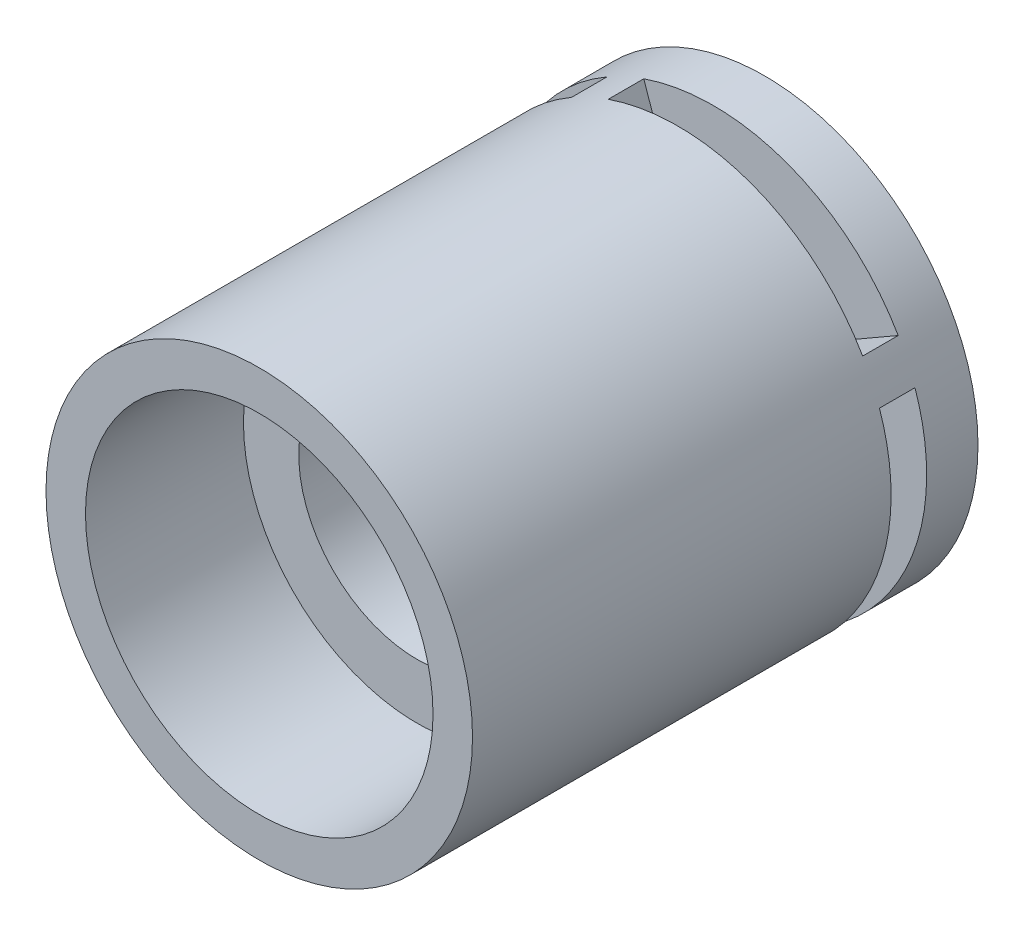
ISO-10303-21;
HEADER;
FILE_DESCRIPTION(('STEP AP214'),'2;1');
FILE_NAME('part.step','',(''),(''),'','','');
FILE_SCHEMA(('AUTOMOTIVE_DESIGN { 1 0 10303 214 1 1 1 1 }'));
ENDSEC;
DATA;
#1=APPLICATION_CONTEXT('core data for automotive mechanical design processes');
#2=APPLICATION_PROTOCOL_DEFINITION('international standard','automotive_design',2000,#1);
#3=PRODUCT_CONTEXT('',#1,'mechanical');
#4=PRODUCT('Part','Part','',(#3));
#5=PRODUCT_RELATED_PRODUCT_CATEGORY('part','',(#4));
#6=PRODUCT_DEFINITION_FORMATION('','',#4);
#7=PRODUCT_DEFINITION_CONTEXT('part definition',#1,'design');
#8=PRODUCT_DEFINITION('design','',#6,#7);
#9=PRODUCT_DEFINITION_SHAPE('','',#8);
#10=(LENGTH_UNIT() NAMED_UNIT(*) SI_UNIT(.MILLI.,.METRE.));
#11=(NAMED_UNIT(*) PLANE_ANGLE_UNIT() SI_UNIT($,.RADIAN.));
#12=(NAMED_UNIT(*) SI_UNIT($,.STERADIAN.) SOLID_ANGLE_UNIT());
#13=UNCERTAINTY_MEASURE_WITH_UNIT(LENGTH_MEASURE(1.E-05),#10,'distance_accuracy_value','');
#14=(GEOMETRIC_REPRESENTATION_CONTEXT(3) GLOBAL_UNCERTAINTY_ASSIGNED_CONTEXT((#13)) GLOBAL_UNIT_ASSIGNED_CONTEXT((#10,
#11,#12)) REPRESENTATION_CONTEXT('',''));
#15=CARTESIAN_POINT('',(0.,0.,0.));
#16=DIRECTION('',(0.,0.,1.));
#17=DIRECTION('',(1.,0.,0.));
#18=AXIS2_PLACEMENT_3D('',#15,#16,#17);
#19=CARTESIAN_POINT('',(0.,0.,-32.));
#20=DIRECTION('',(0.,0.,1.));
#21=DIRECTION('',(1.,0.,0.));
#22=AXIS2_PLACEMENT_3D('',#19,#20,#21);
#23=CYLINDRICAL_SURFACE('',#22,13.5);
#24=DIRECTION('',(0.,0.,-1.));
#25=VECTOR('',#24,1.);
#26=CARTESIAN_POINT('',(6.7374281199444,-11.6985923225225,-26.5));
#27=LINE('',#26,#25);
#28=CARTESIAN_POINT('',(6.7374281199444,-11.6985923225225,-26.5));
#29=VERTEX_POINT('',#28);
#30=CARTESIAN_POINT('',(6.7374281199444,-11.6985923225225,-28.75));
#31=VERTEX_POINT('',#30);
#32=EDGE_CURVE('E306',#29,#31,#27,.T.);
#33=ORIENTED_EDGE('',*,*,#32,.F.);
#34=CARTESIAN_POINT('',(0.,0.,-26.5));
#35=DIRECTION('',(0.,0.,1.));
#36=DIRECTION('',(0.945167105626872,0.326587113096831,0.));
#37=AXIS2_PLACEMENT_3D('',#34,#35,#36);
#38=CIRCLE('',#37,13.5);
#39=CARTESIAN_POINT('',(12.7597559259628,4.40892602680721,-26.5));
#40=VERTEX_POINT('',#39);
#41=EDGE_CURVE('E311',#29,#40,#38,.T.);
#42=ORIENTED_EDGE('',*,*,#41,.T.);
#43=DIRECTION('',(0.,0.,1.));
#44=VECTOR('',#43,1.);
#45=CARTESIAN_POINT('',(12.7597559259628,4.40892602680721,-28.75));
#46=LINE('',#45,#44);
#47=CARTESIAN_POINT('',(12.7597559259628,4.40892602680721,-28.75));
#48=VERTEX_POINT('',#47);
#49=EDGE_CURVE('E195',#48,#40,#46,.T.);
#50=ORIENTED_EDGE('',*,*,#49,.F.);
#51=CARTESIAN_POINT('',(0.,0.,-28.75));
#52=DIRECTION('',(0.,0.,1.));
#53=DIRECTION('',(0.945167105626872,0.326587113096831,0.));
#54=AXIS2_PLACEMENT_3D('',#51,#52,#53);
#55=CIRCLE('',#54,13.5);
#56=EDGE_CURVE('E299',#31,#48,#55,.T.);
#57=ORIENTED_EDGE('',*,*,#56,.F.);
#58=EDGE_LOOP('',(#33,#42,#50,#57));
#59=FACE_BOUND('',#58,.T.);
#60=DIRECTION('',(0.,0.,-1.));
#61=VECTOR('',#60,1.);
#62=CARTESIAN_POINT('',(-11.6985923225225,-6.73742811994444,-26.5));
#63=LINE('',#62,#61);
#64=CARTESIAN_POINT('',(-11.6985923225225,-6.73742811994444,-26.5));
#65=VERTEX_POINT('',#64);
#66=CARTESIAN_POINT('',(-11.6985923225225,-6.73742811994444,-28.75));
#67=VERTEX_POINT('',#66);
#68=EDGE_CURVE('E334',#65,#67,#63,.T.);
#69=ORIENTED_EDGE('',*,*,#68,.F.);
#70=CARTESIAN_POINT('',(0.,0.,-26.5));
#71=DIRECTION('',(0.,0.,1.));
#72=DIRECTION('',(0.326587113096834,-0.945167105626871,0.));
#73=AXIS2_PLACEMENT_3D('',#70,#71,#72);
#74=CIRCLE('',#73,13.5);
#75=CARTESIAN_POINT('',(4.40892602680726,-12.7597559259628,-26.5));
#76=VERTEX_POINT('',#75);
#77=EDGE_CURVE('E338',#65,#76,#74,.T.);
#78=ORIENTED_EDGE('',*,*,#77,.T.);
#79=DIRECTION('',(0.,0.,1.));
#80=VECTOR('',#79,1.);
#81=CARTESIAN_POINT('',(4.40892602680726,-12.7597559259628,-28.75));
#82=LINE('',#81,#80);
#83=CARTESIAN_POINT('',(4.40892602680726,-12.7597559259628,-28.75));
#84=VERTEX_POINT('',#83);
#85=EDGE_CURVE('E327',#84,#76,#82,.T.);
#86=ORIENTED_EDGE('',*,*,#85,.F.);
#87=CARTESIAN_POINT('',(0.,0.,-28.75));
#88=DIRECTION('',(0.,0.,1.));
#89=DIRECTION('',(0.326587113096834,-0.945167105626871,0.));
#90=AXIS2_PLACEMENT_3D('',#87,#88,#89);
#91=CIRCLE('',#90,13.5);
#92=EDGE_CURVE('E329',#67,#84,#91,.T.);
#93=ORIENTED_EDGE('',*,*,#92,.F.);
#94=EDGE_LOOP('',(#69,#78,#86,#93));
#95=FACE_BOUND('',#94,.T.);
#96=DIRECTION('',(0.,0.,-1.));
#97=VECTOR('',#96,1.);
#98=CARTESIAN_POINT('',(-6.73742811994432,11.6985923225226,-26.5));
#99=LINE('',#98,#97);
#100=CARTESIAN_POINT('',(-6.73742811994432,11.6985923225226,-26.5));
#101=VERTEX_POINT('',#100);
#102=CARTESIAN_POINT('',(-6.73742811994431,11.6985923225226,-28.75));
#103=VERTEX_POINT('',#102);
#104=EDGE_CURVE('E362',#101,#103,#99,.T.);
#105=ORIENTED_EDGE('',*,*,#104,.F.);
#106=CARTESIAN_POINT('',(0.,0.,-26.5));
#107=DIRECTION('',(0.,0.,1.));
#108=DIRECTION('',(-0.945167105626874,-0.326587113096824,0.));
#109=AXIS2_PLACEMENT_3D('',#106,#107,#108);
#110=CIRCLE('',#109,13.5);
#111=CARTESIAN_POINT('',(-12.7597559259628,-4.40892602680712,-26.5));
#112=VERTEX_POINT('',#111);
#113=EDGE_CURVE('E366',#101,#112,#110,.T.);
#114=ORIENTED_EDGE('',*,*,#113,.T.);
#115=DIRECTION('',(0.,0.,1.));
#116=VECTOR('',#115,1.);
#117=CARTESIAN_POINT('',(-12.7597559259628,-4.40892602680712,-28.75));
#118=LINE('',#117,#116);
#119=CARTESIAN_POINT('',(-12.7597559259628,-4.40892602680712,-28.75));
#120=VERTEX_POINT('',#119);
#121=EDGE_CURVE('E353',#120,#112,#118,.T.);
#122=ORIENTED_EDGE('',*,*,#121,.F.);
#123=CARTESIAN_POINT('',(0.,0.,-28.75));
#124=DIRECTION('',(0.,0.,1.));
#125=DIRECTION('',(-0.945167105626874,-0.326587113096824,0.));
#126=AXIS2_PLACEMENT_3D('',#123,#124,#125);
#127=CIRCLE('',#126,13.5);
#128=EDGE_CURVE('E357',#103,#120,#127,.T.);
#129=ORIENTED_EDGE('',*,*,#128,.F.);
#130=EDGE_LOOP('',(#105,#114,#122,#129));
#131=FACE_BOUND('',#130,.T.);
#132=DIRECTION('',(0.,0.,-1.));
#133=VECTOR('',#132,1.);
#134=CARTESIAN_POINT('',(11.6985923225226,6.73742811994427,-26.5));
#135=LINE('',#134,#133);
#136=CARTESIAN_POINT('',(11.6985923225226,6.73742811994427,-26.5));
#137=VERTEX_POINT('',#136);
#138=CARTESIAN_POINT('',(11.6985923225226,6.73742811994427,-28.75));
#139=VERTEX_POINT('',#138);
#140=EDGE_CURVE('E390',#137,#139,#135,.T.);
#141=ORIENTED_EDGE('',*,*,#140,.F.);
#142=CARTESIAN_POINT('',(0.,0.,-26.5));
#143=DIRECTION('',(0.,0.,1.));
#144=DIRECTION('',(-0.326587113096821,0.945167105626875,0.));
#145=AXIS2_PLACEMENT_3D('',#142,#143,#144);
#146=CIRCLE('',#145,13.5);
#147=CARTESIAN_POINT('',(-4.40892602680708,12.7597559259628,-26.5));
#148=VERTEX_POINT('',#147);
#149=EDGE_CURVE('E394',#137,#148,#146,.T.);
#150=ORIENTED_EDGE('',*,*,#149,.T.);
#151=DIRECTION('',(0.,0.,1.));
#152=VECTOR('',#151,1.);
#153=CARTESIAN_POINT('',(-4.40892602680708,12.7597559259628,-28.75));
#154=LINE('',#153,#152);
#155=CARTESIAN_POINT('',(-4.40892602680708,12.7597559259628,-28.75));
#156=VERTEX_POINT('',#155);
#157=EDGE_CURVE('E381',#156,#148,#154,.T.);
#158=ORIENTED_EDGE('',*,*,#157,.F.);
#159=CARTESIAN_POINT('',(0.,0.,-28.75));
#160=DIRECTION('',(0.,0.,1.));
#161=DIRECTION('',(-0.326587113096821,0.945167105626875,0.));
#162=AXIS2_PLACEMENT_3D('',#159,#160,#161);
#163=CIRCLE('',#162,13.5);
#164=EDGE_CURVE('E385',#139,#156,#163,.T.);
#165=ORIENTED_EDGE('',*,*,#164,.F.);
#166=EDGE_LOOP('',(#141,#150,#158,#165));
#167=FACE_BOUND('',#166,.T.);
#168=CARTESIAN_POINT('',(0.,0.,-32.));
#169=DIRECTION('',(0.,0.,1.));
#170=DIRECTION('',(1.,0.,0.));
#171=AXIS2_PLACEMENT_3D('',#168,#169,#170);
#172=CIRCLE('',#171,13.5);
#173=CARTESIAN_POINT('',(13.5,0.,-32.));
#174=VERTEX_POINT('',#173);
#175=EDGE_CURVE('E426',#174,#174,#172,.T.);
#176=ORIENTED_EDGE('',*,*,#175,.T.);
#177=EDGE_LOOP('',(#176));
#178=FACE_BOUND('',#177,.T.);
#179=CARTESIAN_POINT('',(0.,0.,0.));
#180=DIRECTION('',(0.,0.,1.));
#181=DIRECTION('',(1.,0.,0.));
#182=AXIS2_PLACEMENT_3D('',#179,#180,#181);
#183=CIRCLE('',#182,13.5);
#184=CARTESIAN_POINT('',(13.5,0.,0.));
#185=VERTEX_POINT('',#184);
#186=EDGE_CURVE('E421',#185,#185,#183,.T.);
#187=ORIENTED_EDGE('',*,*,#186,.F.);
#188=EDGE_LOOP('',(#187));
#189=FACE_BOUND('',#188,.T.);
#190=ADVANCED_FACE('F180',(#59,#95,#131,#167,#178,#189),#23,.T.);
#191=CARTESIAN_POINT('',(0.,0.,-32.));
#192=DIRECTION('',(0.,0.,1.));
#193=DIRECTION('',(1.,0.,0.));
#194=AXIS2_PLACEMENT_3D('',#191,#192,#193);
#195=PLANE('',#194);
#196=ORIENTED_EDGE('',*,*,#175,.F.);
#197=EDGE_LOOP('',(#196));
#198=FACE_BOUND('',#197,.T.);
#199=ADVANCED_FACE('F506',(#198),#195,.F.);
#200=CARTESIAN_POINT('',(0.,0.,0.));
#201=DIRECTION('',(0.,0.,1.));
#202=DIRECTION('',(1.,0.,0.));
#203=AXIS2_PLACEMENT_3D('',#200,#201,#202);
#204=PLANE('',#203);
#205=CARTESIAN_POINT('',(0.,0.,0.));
#206=DIRECTION('',(0.,0.,1.));
#207=DIRECTION('',(1.,0.,0.));
#208=AXIS2_PLACEMENT_3D('',#205,#206,#207);
#209=CIRCLE('',#208,11.);
#210=CARTESIAN_POINT('',(11.,0.,0.));
#211=VERTEX_POINT('',#210);
#212=EDGE_CURVE('E422',#211,#211,#209,.T.);
#213=ORIENTED_EDGE('',*,*,#212,.F.);
#214=EDGE_LOOP('',(#213));
#215=FACE_BOUND('',#214,.T.);
#216=ORIENTED_EDGE('',*,*,#186,.T.);
#217=EDGE_LOOP('',(#216));
#218=FACE_BOUND('',#217,.T.);
#219=ADVANCED_FACE('F512',(#215,#218),#204,.T.);
#220=CARTESIAN_POINT('',(0.,0.,-10.));
#221=DIRECTION('',(0.,0.,1.));
#222=DIRECTION('',(1.,0.,0.));
#223=AXIS2_PLACEMENT_3D('',#220,#221,#222);
#224=CYLINDRICAL_SURFACE('',#223,11.);
#225=CARTESIAN_POINT('',(0.,0.,-10.));
#226=DIRECTION('',(0.,0.,1.));
#227=DIRECTION('',(1.,0.,0.));
#228=AXIS2_PLACEMENT_3D('',#225,#226,#227);
#229=CIRCLE('',#228,11.);
#230=CARTESIAN_POINT('',(11.,0.,-10.));
#231=VERTEX_POINT('',#230);
#232=EDGE_CURVE('E417',#231,#231,#229,.T.);
#233=ORIENTED_EDGE('',*,*,#232,.F.);
#234=EDGE_LOOP('',(#233));
#235=FACE_BOUND('',#234,.T.);
#236=ORIENTED_EDGE('',*,*,#212,.T.);
#237=EDGE_LOOP('',(#236));
#238=FACE_BOUND('',#237,.T.);
#239=ADVANCED_FACE('F518',(#235,#238),#224,.F.);
#240=CARTESIAN_POINT('',(0.,0.,-10.));
#241=DIRECTION('',(0.,0.,1.));
#242=DIRECTION('',(1.,0.,0.));
#243=AXIS2_PLACEMENT_3D('',#240,#241,#242);
#244=PLANE('',#243);
#245=CARTESIAN_POINT('',(0.,0.,-10.));
#246=DIRECTION('',(0.,0.,1.));
#247=DIRECTION('',(1.,0.,0.));
#248=AXIS2_PLACEMENT_3D('',#245,#246,#247);
#249=CIRCLE('',#248,7.5);
#250=CARTESIAN_POINT('',(7.5,0.,-10.));
#251=VERTEX_POINT('',#250);
#252=EDGE_CURVE('E416',#251,#251,#249,.T.);
#253=ORIENTED_EDGE('',*,*,#252,.F.);
#254=EDGE_LOOP('',(#253));
#255=FACE_BOUND('',#254,.T.);
#256=ORIENTED_EDGE('',*,*,#232,.T.);
#257=EDGE_LOOP('',(#256));
#258=FACE_BOUND('',#257,.T.);
#259=ADVANCED_FACE('F524',(#255,#258),#244,.T.);
#260=CARTESIAN_POINT('',(0.,0.,-30.));
#261=DIRECTION('',(0.,0.,1.));
#262=DIRECTION('',(1.,0.,0.));
#263=AXIS2_PLACEMENT_3D('',#260,#261,#262);
#264=CYLINDRICAL_SURFACE('',#263,7.5);
#265=CARTESIAN_POINT('',(0.,0.,-26.5));
#266=DIRECTION('',(0.,0.,-1.));
#267=DIRECTION('',(-1.,0.,0.));
#268=AXIS2_PLACEMENT_3D('',#265,#266,#267);
#269=CIRCLE('',#268,7.5);
#270=CARTESIAN_POINT('',(7.08875329220154,2.44940334822623,-26.5));
#271=VERTEX_POINT('',#270);
#272=CARTESIAN_POINT('',(3.74301562219133,-6.49921795695695,-26.5));
#273=VERTEX_POINT('',#272);
#274=EDGE_CURVE('E484',#271,#273,#269,.T.);
#275=ORIENTED_EDGE('',*,*,#274,.T.);
#276=DIRECTION('',(0.,0.,1.));
#277=VECTOR('',#276,1.);
#278=CARTESIAN_POINT('',(3.74301562219133,-6.49921795695695,-30.));
#279=LINE('',#278,#277);
#280=CARTESIAN_POINT('',(3.74301562219133,-6.49921795695695,-28.75));
#281=VERTEX_POINT('',#280);
#282=EDGE_CURVE('E13',#273,#281,#279,.F.);
#283=ORIENTED_EDGE('',*,*,#282,.T.);
#284=CARTESIAN_POINT('',(0.,0.,-28.75));
#285=DIRECTION('',(0.,0.,-1.));
#286=DIRECTION('',(-1.,0.,0.));
#287=AXIS2_PLACEMENT_3D('',#284,#285,#286);
#288=CIRCLE('',#287,7.5);
#289=CARTESIAN_POINT('',(7.08875329220154,2.44940334822623,-28.75));
#290=VERTEX_POINT('',#289);
#291=EDGE_CURVE('E188',#281,#290,#288,.F.);
#292=ORIENTED_EDGE('',*,*,#291,.T.);
#293=DIRECTION('',(0.,0.,1.));
#294=VECTOR('',#293,1.);
#295=CARTESIAN_POINT('',(7.08875329220154,2.44940334822623,-30.));
#296=LINE('',#295,#294);
#297=EDGE_CURVE('E488',#290,#271,#296,.T.);
#298=ORIENTED_EDGE('',*,*,#297,.T.);
#299=EDGE_LOOP('',(#275,#283,#292,#298));
#300=FACE_BOUND('',#299,.T.);
#301=CARTESIAN_POINT('',(0.,0.,-26.5));
#302=DIRECTION('',(0.,0.,-1.));
#303=DIRECTION('',(-1.,0.,0.));
#304=AXIS2_PLACEMENT_3D('',#301,#302,#303);
#305=CIRCLE('',#304,7.5);
#306=CARTESIAN_POINT('',(2.44940334822626,-7.08875329220153,-26.5));
#307=VERTEX_POINT('',#306);
#308=CARTESIAN_POINT('',(-6.49921795695693,-3.74301562219136,-26.5));
#309=VERTEX_POINT('',#308);
#310=EDGE_CURVE('E468',#307,#309,#305,.T.);
#311=ORIENTED_EDGE('',*,*,#310,.T.);
#312=DIRECTION('',(0.,0.,1.));
#313=VECTOR('',#312,1.);
#314=CARTESIAN_POINT('',(-6.49921795695693,-3.74301562219136,-30.));
#315=LINE('',#314,#313);
#316=CARTESIAN_POINT('',(-6.49921795695693,-3.74301562219136,-28.75));
#317=VERTEX_POINT('',#316);
#318=EDGE_CURVE('E480',#309,#317,#315,.F.);
#319=ORIENTED_EDGE('',*,*,#318,.T.);
#320=CARTESIAN_POINT('',(0.,0.,-28.75));
#321=DIRECTION('',(0.,0.,-1.));
#322=DIRECTION('',(-1.,0.,0.));
#323=AXIS2_PLACEMENT_3D('',#320,#321,#322);
#324=CIRCLE('',#323,7.5);
#325=CARTESIAN_POINT('',(2.44940334822626,-7.08875329220153,-28.75));
#326=VERTEX_POINT('',#325);
#327=EDGE_CURVE('E476',#317,#326,#324,.F.);
#328=ORIENTED_EDGE('',*,*,#327,.T.);
#329=DIRECTION('',(0.,0.,1.));
#330=VECTOR('',#329,1.);
#331=CARTESIAN_POINT('',(2.44940334822626,-7.08875329220153,-30.));
#332=LINE('',#331,#330);
#333=EDGE_CURVE('E472',#326,#307,#332,.T.);
#334=ORIENTED_EDGE('',*,*,#333,.T.);
#335=EDGE_LOOP('',(#311,#319,#328,#334));
#336=FACE_BOUND('',#335,.T.);
#337=CARTESIAN_POINT('',(0.,0.,-26.5));
#338=DIRECTION('',(0.,0.,-1.));
#339=DIRECTION('',(-1.,0.,0.));
#340=AXIS2_PLACEMENT_3D('',#337,#338,#339);
#341=CIRCLE('',#340,7.5);
#342=CARTESIAN_POINT('',(-7.08875329220155,-2.44940334822618,-26.5));
#343=VERTEX_POINT('',#342);
#344=CARTESIAN_POINT('',(-3.74301562219129,6.49921795695697,-26.5));
#345=VERTEX_POINT('',#344);
#346=EDGE_CURVE('E452',#343,#345,#341,.T.);
#347=ORIENTED_EDGE('',*,*,#346,.T.);
#348=DIRECTION('',(0.,0.,1.));
#349=VECTOR('',#348,1.);
#350=CARTESIAN_POINT('',(-3.74301562219129,6.49921795695697,-30.));
#351=LINE('',#350,#349);
#352=CARTESIAN_POINT('',(-3.74301562219128,6.49921795695697,-28.75));
#353=VERTEX_POINT('',#352);
#354=EDGE_CURVE('E464',#345,#353,#351,.F.);
#355=ORIENTED_EDGE('',*,*,#354,.T.);
#356=CARTESIAN_POINT('',(0.,0.,-28.75));
#357=DIRECTION('',(0.,0.,-1.));
#358=DIRECTION('',(-1.,0.,0.));
#359=AXIS2_PLACEMENT_3D('',#356,#357,#358);
#360=CIRCLE('',#359,7.5);
#361=CARTESIAN_POINT('',(-7.08875329220155,-2.44940334822618,-28.75));
#362=VERTEX_POINT('',#361);
#363=EDGE_CURVE('E460',#353,#362,#360,.F.);
#364=ORIENTED_EDGE('',*,*,#363,.T.);
#365=DIRECTION('',(0.,0.,1.));
#366=VECTOR('',#365,1.);
#367=CARTESIAN_POINT('',(-7.08875329220155,-2.44940334822618,-30.));
#368=LINE('',#367,#366);
#369=EDGE_CURVE('E456',#362,#343,#368,.T.);
#370=ORIENTED_EDGE('',*,*,#369,.T.);
#371=EDGE_LOOP('',(#347,#355,#364,#370));
#372=FACE_BOUND('',#371,.T.);
#373=CARTESIAN_POINT('',(0.,0.,-26.5));
#374=DIRECTION('',(0.,0.,-1.));
#375=DIRECTION('',(-1.,0.,0.));
#376=AXIS2_PLACEMENT_3D('',#373,#374,#375);
#377=CIRCLE('',#376,7.5);
#378=CARTESIAN_POINT('',(-2.44940334822615,7.08875329220156,-26.5));
#379=VERTEX_POINT('',#378);
#380=CARTESIAN_POINT('',(6.49921795695699,3.74301562219126,-26.5));
#381=VERTEX_POINT('',#380);
#382=EDGE_CURVE('E430',#379,#381,#377,.T.);
#383=ORIENTED_EDGE('',*,*,#382,.T.);
#384=DIRECTION('',(0.,0.,1.));
#385=VECTOR('',#384,1.);
#386=CARTESIAN_POINT('',(6.49921795695699,3.74301562219126,-30.));
#387=LINE('',#386,#385);
#388=CARTESIAN_POINT('',(6.49921795695699,3.74301562219126,-28.75));
#389=VERTEX_POINT('',#388);
#390=EDGE_CURVE('E448',#381,#389,#387,.F.);
#391=ORIENTED_EDGE('',*,*,#390,.T.);
#392=CARTESIAN_POINT('',(0.,0.,-28.75));
#393=DIRECTION('',(0.,0.,-1.));
#394=DIRECTION('',(-1.,0.,0.));
#395=AXIS2_PLACEMENT_3D('',#392,#393,#394);
#396=CIRCLE('',#395,7.5);
#397=CARTESIAN_POINT('',(-2.44940334822615,7.08875329220156,-28.75));
#398=VERTEX_POINT('',#397);
#399=EDGE_CURVE('E444',#389,#398,#396,.F.);
#400=ORIENTED_EDGE('',*,*,#399,.T.);
#401=DIRECTION('',(0.,0.,1.));
#402=VECTOR('',#401,1.);
#403=CARTESIAN_POINT('',(-2.44940334822615,7.08875329220156,-30.));
#404=LINE('',#403,#402);
#405=EDGE_CURVE('E440',#398,#379,#404,.T.);
#406=ORIENTED_EDGE('',*,*,#405,.T.);
#407=EDGE_LOOP('',(#383,#391,#400,#406));
#408=FACE_BOUND('',#407,.T.);
#409=ORIENTED_EDGE('',*,*,#252,.T.);
#410=EDGE_LOOP('',(#409));
#411=FACE_BOUND('',#410,.T.);
#412=CARTESIAN_POINT('',(0.,0.,-30.));
#413=DIRECTION('',(0.,0.,1.));
#414=DIRECTION('',(1.,0.,0.));
#415=AXIS2_PLACEMENT_3D('',#412,#413,#414);
#416=CIRCLE('',#415,7.5);
#417=CARTESIAN_POINT('',(7.5,0.,-30.));
#418=VERTEX_POINT('',#417);
#419=EDGE_CURVE('E409',#418,#418,#416,.T.);
#420=ORIENTED_EDGE('',*,*,#419,.F.);
#421=EDGE_LOOP('',(#420));
#422=FACE_BOUND('',#421,.T.);
#423=ADVANCED_FACE('F493',(#300,#336,#372,#408,#411,#422),#264,.F.);
#424=CARTESIAN_POINT('',(0.,0.,-30.));
#425=DIRECTION('',(0.,0.,1.));
#426=DIRECTION('',(1.,0.,0.));
#427=AXIS2_PLACEMENT_3D('',#424,#425,#426);
#428=PLANE('',#427);
#429=ORIENTED_EDGE('',*,*,#419,.T.);
#430=EDGE_LOOP('',(#429));
#431=FACE_BOUND('',#430,.T.);
#432=ADVANCED_FACE('F530',(#431),#428,.T.);
#433=CARTESIAN_POINT('',(11.6985923225226,6.73742811994427,-27.625));
#434=DIRECTION('',(0.499068749625502,-0.866562394260932,0.));
#435=DIRECTION('',(0.,0.,-1.));
#436=AXIS2_PLACEMENT_3D('',#433,#434,#435);
#437=PLANE('',#436);
#438=DIRECTION('',(0.866562394260932,0.499068749625502,0.));
#439=VECTOR('',#438,1.);
#440=CARTESIAN_POINT('',(11.6985923225226,6.73742811994427,-26.5));
#441=LINE('',#440,#439);
#442=EDGE_CURVE('E406',#381,#137,#441,.T.);
#443=ORIENTED_EDGE('',*,*,#442,.T.);
#444=ORIENTED_EDGE('',*,*,#140,.T.);
#445=DIRECTION('',(0.866562394260932,0.499068749625502,0.));
#446=VECTOR('',#445,1.);
#447=CARTESIAN_POINT('',(11.6985923225226,6.73742811994427,-28.75));
#448=LINE('',#447,#446);
#449=EDGE_CURVE('E403',#389,#139,#448,.T.);
#450=ORIENTED_EDGE('',*,*,#449,.F.);
#451=ORIENTED_EDGE('',*,*,#390,.F.);
#452=EDGE_LOOP('',(#443,#444,#450,#451));
#453=FACE_BOUND('',#452,.T.);
#454=ADVANCED_FACE('F533',(#453),#437,.F.);
#455=CARTESIAN_POINT('',(0.,0.,-28.75));
#456=DIRECTION('',(0.,0.,-1.));
#457=DIRECTION('',(-1.,0.,0.));
#458=AXIS2_PLACEMENT_3D('',#455,#456,#457);
#459=PLANE('',#458);
#460=ORIENTED_EDGE('',*,*,#449,.T.);
#461=ORIENTED_EDGE('',*,*,#164,.T.);
#462=DIRECTION('',(-0.32658711309682,0.945167105626875,0.));
#463=VECTOR('',#462,1.);
#464=CARTESIAN_POINT('',(-4.40892602680708,12.7597559259628,-28.75));
#465=LINE('',#464,#463);
#466=EDGE_CURVE('E400',#398,#156,#465,.T.);
#467=ORIENTED_EDGE('',*,*,#466,.F.);
#468=ORIENTED_EDGE('',*,*,#399,.F.);
#469=EDGE_LOOP('',(#460,#461,#467,#468));
#470=FACE_BOUND('',#469,.T.);
#471=ADVANCED_FACE('F543',(#470),#459,.F.);
#472=CARTESIAN_POINT('',(-4.40892602680708,12.7597559259628,-27.625));
#473=DIRECTION('',(-0.945167105626875,-0.326587113096821,0.));
#474=DIRECTION('',(0.,0.,1.));
#475=AXIS2_PLACEMENT_3D('',#472,#473,#474);
#476=PLANE('',#475);
#477=ORIENTED_EDGE('',*,*,#466,.T.);
#478=ORIENTED_EDGE('',*,*,#157,.T.);
#479=DIRECTION('',(-0.32658711309682,0.945167105626875,0.));
#480=VECTOR('',#479,1.);
#481=CARTESIAN_POINT('',(-4.40892602680708,12.7597559259628,-26.5));
#482=LINE('',#481,#480);
#483=EDGE_CURVE('E389',#379,#148,#482,.T.);
#484=ORIENTED_EDGE('',*,*,#483,.F.);
#485=ORIENTED_EDGE('',*,*,#405,.F.);
#486=EDGE_LOOP('',(#477,#478,#484,#485));
#487=FACE_BOUND('',#486,.T.);
#488=ADVANCED_FACE('F539',(#487),#476,.F.);
#489=CARTESIAN_POINT('',(0.,0.,-26.5));
#490=DIRECTION('',(0.,0.,-1.));
#491=DIRECTION('',(-1.,0.,0.));
#492=AXIS2_PLACEMENT_3D('',#489,#490,#491);
#493=PLANE('',#492);
#494=ORIENTED_EDGE('',*,*,#483,.T.);
#495=ORIENTED_EDGE('',*,*,#149,.F.);
#496=ORIENTED_EDGE('',*,*,#442,.F.);
#497=ORIENTED_EDGE('',*,*,#382,.F.);
#498=EDGE_LOOP('',(#494,#495,#496,#497));
#499=FACE_BOUND('',#498,.T.);
#500=ADVANCED_FACE('F535',(#499),#493,.T.);
#501=CARTESIAN_POINT('',(-6.73742811994432,11.6985923225226,-27.625));
#502=DIRECTION('',(0.86656239426093,0.499068749625505,0.));
#503=DIRECTION('',(0.,0.,-1.));
#504=AXIS2_PLACEMENT_3D('',#501,#502,#503);
#505=PLANE('',#504);
#506=DIRECTION('',(-0.499068749625505,0.86656239426093,0.));
#507=VECTOR('',#506,1.);
#508=CARTESIAN_POINT('',(-6.73742811994432,11.6985923225226,-26.5));
#509=LINE('',#508,#507);
#510=EDGE_CURVE('E378',#345,#101,#509,.T.);
#511=ORIENTED_EDGE('',*,*,#510,.T.);
#512=ORIENTED_EDGE('',*,*,#104,.T.);
#513=DIRECTION('',(-0.499068749625505,0.86656239426093,0.));
#514=VECTOR('',#513,1.);
#515=CARTESIAN_POINT('',(-6.73742811994431,11.6985923225226,-28.75));
#516=LINE('',#515,#514);
#517=EDGE_CURVE('E375',#353,#103,#516,.T.);
#518=ORIENTED_EDGE('',*,*,#517,.F.);
#519=ORIENTED_EDGE('',*,*,#354,.F.);
#520=EDGE_LOOP('',(#511,#512,#518,#519));
#521=FACE_BOUND('',#520,.T.);
#522=ADVANCED_FACE('F538',(#521),#505,.F.);
#523=CARTESIAN_POINT('',(0.,0.,-28.75));
#524=DIRECTION('',(0.,0.,-1.));
#525=DIRECTION('',(-1.,0.,0.));
#526=AXIS2_PLACEMENT_3D('',#523,#524,#525);
#527=PLANE('',#526);
#528=ORIENTED_EDGE('',*,*,#517,.T.);
#529=ORIENTED_EDGE('',*,*,#128,.T.);
#530=DIRECTION('',(-0.945167105626874,-0.326587113096824,0.));
#531=VECTOR('',#530,1.);
#532=CARTESIAN_POINT('',(-12.7597559259628,-4.40892602680712,-28.75));
#533=LINE('',#532,#531);
#534=EDGE_CURVE('E372',#362,#120,#533,.T.);
#535=ORIENTED_EDGE('',*,*,#534,.F.);
#536=ORIENTED_EDGE('',*,*,#363,.F.);
#537=EDGE_LOOP('',(#528,#529,#535,#536));
#538=FACE_BOUND('',#537,.T.);
#539=ADVANCED_FACE('F559',(#538),#527,.F.);
#540=CARTESIAN_POINT('',(-12.7597559259628,-4.40892602680712,-27.625));
#541=DIRECTION('',(0.326587113096824,-0.945167105626874,0.));
#542=DIRECTION('',(0.,0.,1.));
#543=AXIS2_PLACEMENT_3D('',#540,#541,#542);
#544=PLANE('',#543);
#545=ORIENTED_EDGE('',*,*,#534,.T.);
#546=ORIENTED_EDGE('',*,*,#121,.T.);
#547=DIRECTION('',(-0.945167105626874,-0.326587113096824,0.));
#548=VECTOR('',#547,1.);
#549=CARTESIAN_POINT('',(-12.7597559259628,-4.40892602680712,-26.5));
#550=LINE('',#549,#548);
#551=EDGE_CURVE('E361',#343,#112,#550,.T.);
#552=ORIENTED_EDGE('',*,*,#551,.F.);
#553=ORIENTED_EDGE('',*,*,#369,.F.);
#554=EDGE_LOOP('',(#545,#546,#552,#553));
#555=FACE_BOUND('',#554,.T.);
#556=ADVANCED_FACE('F555',(#555),#544,.F.);
#557=CARTESIAN_POINT('',(0.,0.,-26.5));
#558=DIRECTION('',(0.,0.,-1.));
#559=DIRECTION('',(-1.,0.,0.));
#560=AXIS2_PLACEMENT_3D('',#557,#558,#559);
#561=PLANE('',#560);
#562=ORIENTED_EDGE('',*,*,#551,.T.);
#563=ORIENTED_EDGE('',*,*,#113,.F.);
#564=ORIENTED_EDGE('',*,*,#510,.F.);
#565=ORIENTED_EDGE('',*,*,#346,.F.);
#566=EDGE_LOOP('',(#562,#563,#564,#565));
#567=FACE_BOUND('',#566,.T.);
#568=ADVANCED_FACE('F551',(#567),#561,.T.);
#569=CARTESIAN_POINT('',(-11.6985923225225,-6.73742811994444,-27.625));
#570=DIRECTION('',(-0.499068749625514,0.866562394260925,0.));
#571=DIRECTION('',(0.,0.,-1.));
#572=AXIS2_PLACEMENT_3D('',#569,#570,#571);
#573=PLANE('',#572);
#574=DIRECTION('',(-0.866562394260925,-0.499068749625514,0.));
#575=VECTOR('',#574,1.);
#576=CARTESIAN_POINT('',(-11.6985923225225,-6.73742811994444,-26.5));
#577=LINE('',#576,#575);
#578=EDGE_CURVE('E350',#309,#65,#577,.T.);
#579=ORIENTED_EDGE('',*,*,#578,.T.);
#580=ORIENTED_EDGE('',*,*,#68,.T.);
#581=DIRECTION('',(-0.866562394260925,-0.499068749625514,0.));
#582=VECTOR('',#581,1.);
#583=CARTESIAN_POINT('',(-11.6985923225225,-6.73742811994444,-28.75));
#584=LINE('',#583,#582);
#585=EDGE_CURVE('E347',#317,#67,#584,.T.);
#586=ORIENTED_EDGE('',*,*,#585,.F.);
#587=ORIENTED_EDGE('',*,*,#318,.F.);
#588=EDGE_LOOP('',(#579,#580,#586,#587));
#589=FACE_BOUND('',#588,.T.);
#590=ADVANCED_FACE('F554',(#589),#573,.F.);
#591=CARTESIAN_POINT('',(0.,0.,-28.75));
#592=DIRECTION('',(0.,0.,-1.));
#593=DIRECTION('',(-1.,0.,0.));
#594=AXIS2_PLACEMENT_3D('',#591,#592,#593);
#595=PLANE('',#594);
#596=ORIENTED_EDGE('',*,*,#585,.T.);
#597=ORIENTED_EDGE('',*,*,#92,.T.);
#598=DIRECTION('',(0.326587113096834,-0.94516710562687,0.));
#599=VECTOR('',#598,1.);
#600=CARTESIAN_POINT('',(4.40892602680726,-12.7597559259628,-28.75));
#601=LINE('',#600,#599);
#602=EDGE_CURVE('E344',#326,#84,#601,.T.);
#603=ORIENTED_EDGE('',*,*,#602,.F.);
#604=ORIENTED_EDGE('',*,*,#327,.F.);
#605=EDGE_LOOP('',(#596,#597,#603,#604));
#606=FACE_BOUND('',#605,.T.);
#607=ADVANCED_FACE('F574',(#606),#595,.F.);
#608=CARTESIAN_POINT('',(4.40892602680726,-12.7597559259628,-27.625));
#609=DIRECTION('',(0.945167105626871,0.326587113096834,0.));
#610=DIRECTION('',(0.,0.,1.));
#611=AXIS2_PLACEMENT_3D('',#608,#609,#610);
#612=PLANE('',#611);
#613=ORIENTED_EDGE('',*,*,#602,.T.);
#614=ORIENTED_EDGE('',*,*,#85,.T.);
#615=DIRECTION('',(0.326587113096834,-0.94516710562687,0.));
#616=VECTOR('',#615,1.);
#617=CARTESIAN_POINT('',(4.40892602680726,-12.7597559259628,-26.5));
#618=LINE('',#617,#616);
#619=EDGE_CURVE('E333',#307,#76,#618,.T.);
#620=ORIENTED_EDGE('',*,*,#619,.F.);
#621=ORIENTED_EDGE('',*,*,#333,.F.);
#622=EDGE_LOOP('',(#613,#614,#620,#621));
#623=FACE_BOUND('',#622,.T.);
#624=ADVANCED_FACE('F570',(#623),#612,.F.);
#625=CARTESIAN_POINT('',(0.,0.,-26.5));
#626=DIRECTION('',(0.,0.,-1.));
#627=DIRECTION('',(-1.,0.,0.));
#628=AXIS2_PLACEMENT_3D('',#625,#626,#627);
#629=PLANE('',#628);
#630=ORIENTED_EDGE('',*,*,#619,.T.);
#631=ORIENTED_EDGE('',*,*,#77,.F.);
#632=ORIENTED_EDGE('',*,*,#578,.F.);
#633=ORIENTED_EDGE('',*,*,#310,.F.);
#634=EDGE_LOOP('',(#630,#631,#632,#633));
#635=FACE_BOUND('',#634,.T.);
#636=ADVANCED_FACE('F567',(#635),#629,.T.);
#637=CARTESIAN_POINT('',(6.7374281199444,-11.6985923225225,-27.625));
#638=DIRECTION('',(-0.866562394260926,-0.499068749625511,0.));
#639=DIRECTION('',(0.,0.,-1.));
#640=AXIS2_PLACEMENT_3D('',#637,#638,#639);
#641=PLANE('',#640);
#642=DIRECTION('',(0.499068749625511,-0.866562394260926,0.));
#643=VECTOR('',#642,1.);
#644=CARTESIAN_POINT('',(6.7374281199444,-11.6985923225225,-26.5));
#645=LINE('',#644,#643);
#646=EDGE_CURVE('E203',#273,#29,#645,.T.);
#647=ORIENTED_EDGE('',*,*,#646,.T.);
#648=ORIENTED_EDGE('',*,*,#32,.T.);
#649=DIRECTION('',(0.499068749625511,-0.866562394260926,0.));
#650=VECTOR('',#649,1.);
#651=CARTESIAN_POINT('',(6.7374281199444,-11.6985923225225,-28.75));
#652=LINE('',#651,#650);
#653=EDGE_CURVE('E294',#281,#31,#652,.T.);
#654=ORIENTED_EDGE('',*,*,#653,.F.);
#655=ORIENTED_EDGE('',*,*,#282,.F.);
#656=EDGE_LOOP('',(#647,#648,#654,#655));
#657=FACE_BOUND('',#656,.T.);
#658=ADVANCED_FACE('F307',(#657),#641,.F.);
#659=CARTESIAN_POINT('',(0.,0.,-28.75));
#660=DIRECTION('',(0.,0.,-1.));
#661=DIRECTION('',(-1.,0.,0.));
#662=AXIS2_PLACEMENT_3D('',#659,#660,#661);
#663=PLANE('',#662);
#664=ORIENTED_EDGE('',*,*,#653,.T.);
#665=ORIENTED_EDGE('',*,*,#56,.T.);
#666=DIRECTION('',(0.945167105626872,0.326587113096831,0.));
#667=VECTOR('',#666,1.);
#668=CARTESIAN_POINT('',(12.7597559259628,4.40892602680721,-28.75));
#669=LINE('',#668,#667);
#670=EDGE_CURVE('E303',#290,#48,#669,.T.);
#671=ORIENTED_EDGE('',*,*,#670,.F.);
#672=ORIENTED_EDGE('',*,*,#291,.F.);
#673=EDGE_LOOP('',(#664,#665,#671,#672));
#674=FACE_BOUND('',#673,.T.);
#675=ADVANCED_FACE('F296',(#674),#663,.F.);
#676=CARTESIAN_POINT('',(12.7597559259628,4.40892602680721,-27.625));
#677=DIRECTION('',(-0.326587113096831,0.945167105626872,0.));
#678=DIRECTION('',(0.,0.,1.));
#679=AXIS2_PLACEMENT_3D('',#676,#677,#678);
#680=PLANE('',#679);
#681=ORIENTED_EDGE('',*,*,#670,.T.);
#682=ORIENTED_EDGE('',*,*,#49,.T.);
#683=DIRECTION('',(0.945167105626872,0.326587113096831,0.));
#684=VECTOR('',#683,1.);
#685=CARTESIAN_POINT('',(12.7597559259628,4.40892602680721,-26.5));
#686=LINE('',#685,#684);
#687=EDGE_CURVE('E315',#271,#40,#686,.T.);
#688=ORIENTED_EDGE('',*,*,#687,.F.);
#689=ORIENTED_EDGE('',*,*,#297,.F.);
#690=EDGE_LOOP('',(#681,#682,#688,#689));
#691=FACE_BOUND('',#690,.T.);
#692=ADVANCED_FACE('F496',(#691),#680,.F.);
#693=CARTESIAN_POINT('',(0.,0.,-26.5));
#694=DIRECTION('',(0.,0.,-1.));
#695=DIRECTION('',(-1.,0.,0.));
#696=AXIS2_PLACEMENT_3D('',#693,#694,#695);
#697=PLANE('',#696);
#698=ORIENTED_EDGE('',*,*,#687,.T.);
#699=ORIENTED_EDGE('',*,*,#41,.F.);
#700=ORIENTED_EDGE('',*,*,#646,.F.);
#701=ORIENTED_EDGE('',*,*,#274,.F.);
#702=EDGE_LOOP('',(#698,#699,#700,#701));
#703=FACE_BOUND('',#702,.T.);
#704=ADVANCED_FACE('F495',(#703),#697,.T.);
#705=CLOSED_SHELL('',(#190,#199,#219,#239,#259,#423,#432,#454,#471,#488,#500,#522,#539,#556,
#568,#590,#607,#624,#636,#658,#675,#692,#704));
#706=MANIFOLD_SOLID_BREP('B2',#705);
#707=ADVANCED_BREP_SHAPE_REPRESENTATION('',(#18,#706),#14);
#708=SHAPE_DEFINITION_REPRESENTATION(#9,#707);
ENDSEC;
END-ISO-10303-21;
